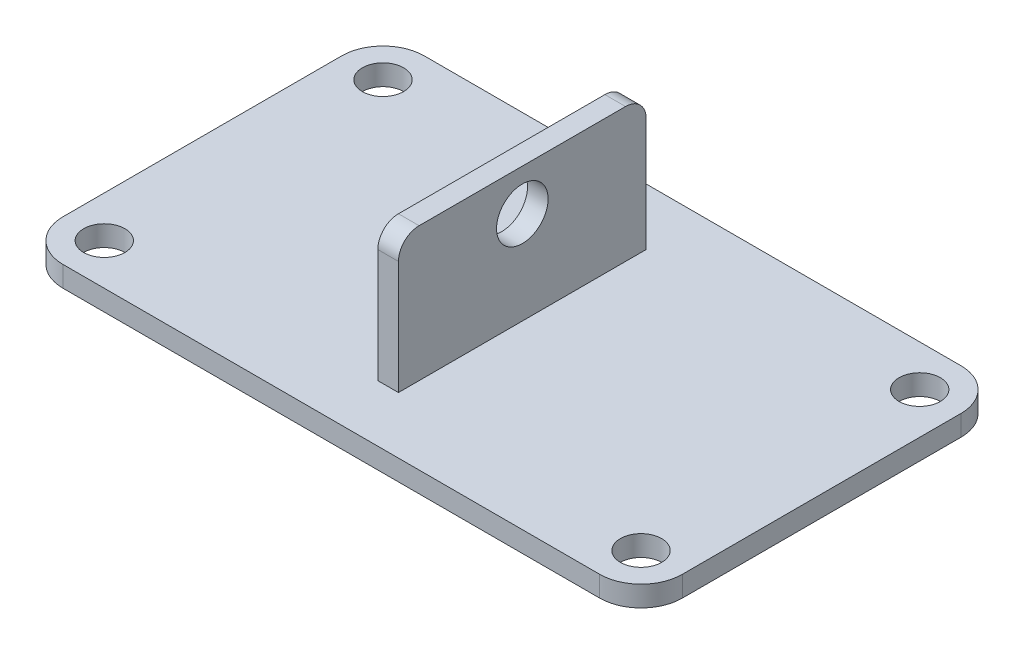
ISO-10303-21;
HEADER;
FILE_DESCRIPTION(('STEP AP214'),'2;1');
FILE_NAME('part.step','',(''),(''),'','','');
FILE_SCHEMA(('AUTOMOTIVE_DESIGN { 1 0 10303 214 1 1 1 1 }'));
ENDSEC;
DATA;
#1=APPLICATION_CONTEXT('core data for automotive mechanical design processes');
#2=APPLICATION_PROTOCOL_DEFINITION('international standard','automotive_design',2000,#1);
#3=PRODUCT_CONTEXT('',#1,'mechanical');
#4=PRODUCT('Part','Part','',(#3));
#5=PRODUCT_RELATED_PRODUCT_CATEGORY('part','',(#4));
#6=PRODUCT_DEFINITION_FORMATION('','',#4);
#7=PRODUCT_DEFINITION_CONTEXT('part definition',#1,'design');
#8=PRODUCT_DEFINITION('design','',#6,#7);
#9=PRODUCT_DEFINITION_SHAPE('','',#8);
#10=(LENGTH_UNIT() NAMED_UNIT(*) SI_UNIT(.MILLI.,.METRE.));
#11=(NAMED_UNIT(*) PLANE_ANGLE_UNIT() SI_UNIT($,.RADIAN.));
#12=(NAMED_UNIT(*) SI_UNIT($,.STERADIAN.) SOLID_ANGLE_UNIT());
#13=UNCERTAINTY_MEASURE_WITH_UNIT(LENGTH_MEASURE(1.E-05),#10,'distance_accuracy_value','');
#14=(GEOMETRIC_REPRESENTATION_CONTEXT(3) GLOBAL_UNCERTAINTY_ASSIGNED_CONTEXT((#13)) GLOBAL_UNIT_ASSIGNED_CONTEXT((#10,
#11,#12)) REPRESENTATION_CONTEXT('',''));
#15=CARTESIAN_POINT('',(0.,0.,0.));
#16=DIRECTION('',(0.,0.,1.));
#17=DIRECTION('',(1.,0.,0.));
#18=AXIS2_PLACEMENT_3D('',#15,#16,#17);
#19=CARTESIAN_POINT('',(0.,10.,0.));
#20=DIRECTION('',(0.,1.,0.));
#21=DIRECTION('',(0.,0.,1.));
#22=AXIS2_PLACEMENT_3D('',#19,#20,#21);
#23=PLANE('',#22);
#24=CARTESIAN_POINT('',(130.,10.,67.5));
#25=DIRECTION('',(0.,1.,0.));
#26=DIRECTION('',(0.,0.,1.));
#27=AXIS2_PLACEMENT_3D('',#24,#25,#26);
#28=CIRCLE('',#27,10.);
#29=CARTESIAN_POINT('',(130.,10.,77.5));
#30=VERTEX_POINT('',#29);
#31=EDGE_CURVE('E483',#30,#30,#28,.T.);
#32=ORIENTED_EDGE('',*,*,#31,.F.);
#33=EDGE_LOOP('',(#32));
#34=FACE_BOUND('',#33,.T.);
#35=CARTESIAN_POINT('',(130.,10.,-67.5));
#36=DIRECTION('',(0.,1.,0.));
#37=DIRECTION('',(0.,0.,1.));
#38=AXIS2_PLACEMENT_3D('',#35,#36,#37);
#39=CIRCLE('',#38,10.);
#40=CARTESIAN_POINT('',(130.,10.,-57.5));
#41=VERTEX_POINT('',#40);
#42=EDGE_CURVE('E490',#41,#41,#39,.T.);
#43=ORIENTED_EDGE('',*,*,#42,.F.);
#44=EDGE_LOOP('',(#43));
#45=FACE_BOUND('',#44,.T.);
#46=CARTESIAN_POINT('',(-130.,10.,67.5));
#47=DIRECTION('',(0.,1.,0.));
#48=DIRECTION('',(0.,0.,1.));
#49=AXIS2_PLACEMENT_3D('',#46,#47,#48);
#50=CIRCLE('',#49,10.);
#51=CARTESIAN_POINT('',(-130.,10.,77.5));
#52=VERTEX_POINT('',#51);
#53=EDGE_CURVE('E500',#52,#52,#50,.T.);
#54=ORIENTED_EDGE('',*,*,#53,.F.);
#55=EDGE_LOOP('',(#54));
#56=FACE_BOUND('',#55,.T.);
#57=CARTESIAN_POINT('',(-130.,10.,-67.5));
#58=DIRECTION('',(0.,1.,0.));
#59=DIRECTION('',(0.,0.,1.));
#60=AXIS2_PLACEMENT_3D('',#57,#58,#59);
#61=CIRCLE('',#60,10.);
#62=CARTESIAN_POINT('',(-130.,10.,-57.5));
#63=VERTEX_POINT('',#62);
#64=EDGE_CURVE('E501',#63,#63,#61,.T.);
#65=ORIENTED_EDGE('',*,*,#64,.F.);
#66=EDGE_LOOP('',(#65));
#67=FACE_BOUND('',#66,.T.);
#68=DIRECTION('',(0.,0.,-1.));
#69=VECTOR('',#68,1.);
#70=CARTESIAN_POINT('',(150.,10.,87.5));
#71=LINE('',#70,#69);
#72=CARTESIAN_POINT('',(150.,10.,67.4999999999999));
#73=VERTEX_POINT('',#72);
#74=CARTESIAN_POINT('',(150.,10.,-67.5));
#75=VERTEX_POINT('',#74);
#76=EDGE_CURVE('E204',#73,#75,#71,.T.);
#77=ORIENTED_EDGE('',*,*,#76,.T.);
#78=CARTESIAN_POINT('',(130.,10.,-67.5));
#79=DIRECTION('',(0.,1.,0.));
#80=DIRECTION('',(0.,0.,1.));
#81=AXIS2_PLACEMENT_3D('',#78,#79,#80);
#82=CIRCLE('',#81,20.);
#83=CARTESIAN_POINT('',(130.,10.,-87.5));
#84=VERTEX_POINT('',#83);
#85=EDGE_CURVE('E261',#75,#84,#82,.T.);
#86=ORIENTED_EDGE('',*,*,#85,.T.);
#87=DIRECTION('',(-1.,0.,0.));
#88=VECTOR('',#87,1.);
#89=CARTESIAN_POINT('',(150.,10.,-87.5));
#90=LINE('',#89,#88);
#91=CARTESIAN_POINT('',(-130.,10.,-87.5));
#92=VERTEX_POINT('',#91);
#93=EDGE_CURVE('E208',#84,#92,#90,.T.);
#94=ORIENTED_EDGE('',*,*,#93,.T.);
#95=CARTESIAN_POINT('',(-130.,10.,-67.5));
#96=DIRECTION('',(0.,1.,0.));
#97=DIRECTION('',(0.,0.,1.));
#98=AXIS2_PLACEMENT_3D('',#95,#96,#97);
#99=CIRCLE('',#98,20.);
#100=CARTESIAN_POINT('',(-150.,10.,-67.5));
#101=VERTEX_POINT('',#100);
#102=EDGE_CURVE('E254',#92,#101,#99,.T.);
#103=ORIENTED_EDGE('',*,*,#102,.T.);
#104=DIRECTION('',(0.,0.,1.));
#105=VECTOR('',#104,1.);
#106=CARTESIAN_POINT('',(-150.,10.,87.5));
#107=LINE('',#106,#105);
#108=CARTESIAN_POINT('',(-150.,10.,67.5));
#109=VERTEX_POINT('',#108);
#110=EDGE_CURVE('E193',#101,#109,#107,.T.);
#111=ORIENTED_EDGE('',*,*,#110,.T.);
#112=CARTESIAN_POINT('',(-130.,10.,67.5));
#113=DIRECTION('',(0.,1.,0.));
#114=DIRECTION('',(0.,0.,1.));
#115=AXIS2_PLACEMENT_3D('',#112,#113,#114);
#116=CIRCLE('',#115,20.);
#117=CARTESIAN_POINT('',(-130.,10.,87.5));
#118=VERTEX_POINT('',#117);
#119=EDGE_CURVE('E252',#109,#118,#116,.T.);
#120=ORIENTED_EDGE('',*,*,#119,.T.);
#121=DIRECTION('',(1.,0.,0.));
#122=VECTOR('',#121,1.);
#123=CARTESIAN_POINT('',(150.,10.,87.5));
#124=LINE('',#123,#122);
#125=CARTESIAN_POINT('',(130.,10.,87.5));
#126=VERTEX_POINT('',#125);
#127=EDGE_CURVE('E200',#118,#126,#124,.T.);
#128=ORIENTED_EDGE('',*,*,#127,.T.);
#129=CARTESIAN_POINT('',(130.,10.,67.4999999999999));
#130=DIRECTION('',(0.,1.,0.));
#131=DIRECTION('',(0.,0.,1.));
#132=AXIS2_PLACEMENT_3D('',#129,#130,#131);
#133=CIRCLE('',#132,20.);
#134=EDGE_CURVE('E256',#126,#73,#133,.T.);
#135=ORIENTED_EDGE('',*,*,#134,.T.);
#136=EDGE_LOOP('',(#77,#86,#94,#103,#111,#120,#128,#135));
#137=FACE_BOUND('',#136,.T.);
#138=DIRECTION('',(-1.,0.,0.));
#139=VECTOR('',#138,1.);
#140=CARTESIAN_POINT('',(5.,10.,60.));
#141=LINE('',#140,#139);
#142=CARTESIAN_POINT('',(5.,10.,60.));
#143=VERTEX_POINT('',#142);
#144=CARTESIAN_POINT('',(-5.,10.,60.));
#145=VERTEX_POINT('',#144);
#146=EDGE_CURVE('E157',#143,#145,#141,.T.);
#147=ORIENTED_EDGE('',*,*,#146,.T.);
#148=DIRECTION('',(0.,0.,-1.));
#149=VECTOR('',#148,1.);
#150=CARTESIAN_POINT('',(-5.,10.,60.));
#151=LINE('',#150,#149);
#152=CARTESIAN_POINT('',(-5.,10.,-60.));
#153=VERTEX_POINT('',#152);
#154=EDGE_CURVE('E181',#145,#153,#151,.T.);
#155=ORIENTED_EDGE('',*,*,#154,.T.);
#156=DIRECTION('',(-1.,0.,0.));
#157=VECTOR('',#156,1.);
#158=CARTESIAN_POINT('',(5.,10.,-60.));
#159=LINE('',#158,#157);
#160=CARTESIAN_POINT('',(5.,10.,-60.));
#161=VERTEX_POINT('',#160);
#162=EDGE_CURVE('E169',#161,#153,#159,.T.);
#163=ORIENTED_EDGE('',*,*,#162,.F.);
#164=DIRECTION('',(0.,0.,-1.));
#165=VECTOR('',#164,1.);
#166=CARTESIAN_POINT('',(5.,10.,60.));
#167=LINE('',#166,#165);
#168=EDGE_CURVE('E155',#143,#161,#167,.T.);
#169=ORIENTED_EDGE('',*,*,#168,.F.);
#170=EDGE_LOOP('',(#147,#155,#163,#169));
#171=FACE_BOUND('',#170,.T.);
#172=ADVANCED_FACE('F44',(#34,#45,#56,#67,#137,#171),#23,.T.);
#173=CARTESIAN_POINT('',(-150.,10.,87.5));
#174=DIRECTION('',(1.,0.,0.));
#175=DIRECTION('',(0.,0.,-1.));
#176=AXIS2_PLACEMENT_3D('',#173,#174,#175);
#177=PLANE('',#176);
#178=ORIENTED_EDGE('',*,*,#110,.F.);
#179=DIRECTION('',(0.,-1.,0.));
#180=VECTOR('',#179,1.);
#181=CARTESIAN_POINT('',(-150.,10.,-67.5));
#182=LINE('',#181,#180);
#183=CARTESIAN_POINT('',(-150.,0.,-67.5));
#184=VERTEX_POINT('',#183);
#185=EDGE_CURVE('E273',#101,#184,#182,.T.);
#186=ORIENTED_EDGE('',*,*,#185,.T.);
#187=DIRECTION('',(0.,0.,1.));
#188=VECTOR('',#187,1.);
#189=CARTESIAN_POINT('',(-150.,0.,87.5));
#190=LINE('',#189,#188);
#191=CARTESIAN_POINT('',(-150.,0.,67.5));
#192=VERTEX_POINT('',#191);
#193=EDGE_CURVE('E170',#184,#192,#190,.T.);
#194=ORIENTED_EDGE('',*,*,#193,.T.);
#195=DIRECTION('',(0.,-1.,0.));
#196=VECTOR('',#195,1.);
#197=CARTESIAN_POINT('',(-150.,10.,67.5));
#198=LINE('',#197,#196);
#199=EDGE_CURVE('E271',#192,#109,#198,.F.);
#200=ORIENTED_EDGE('',*,*,#199,.T.);
#201=EDGE_LOOP('',(#178,#186,#194,#200));
#202=FACE_BOUND('',#201,.T.);
#203=ADVANCED_FACE('F317',(#202),#177,.F.);
#204=CARTESIAN_POINT('',(150.,10.,87.5));
#205=DIRECTION('',(0.,0.,-1.));
#206=DIRECTION('',(-1.,0.,0.));
#207=AXIS2_PLACEMENT_3D('',#204,#205,#206);
#208=PLANE('',#207);
#209=DIRECTION('',(1.,0.,0.));
#210=VECTOR('',#209,1.);
#211=CARTESIAN_POINT('',(150.,0.,87.5));
#212=LINE('',#211,#210);
#213=CARTESIAN_POINT('',(-130.,0.,87.5));
#214=VERTEX_POINT('',#213);
#215=CARTESIAN_POINT('',(130.,0.,87.5));
#216=VERTEX_POINT('',#215);
#217=EDGE_CURVE('E216',#214,#216,#212,.T.);
#218=ORIENTED_EDGE('',*,*,#217,.T.);
#219=DIRECTION('',(0.,-1.,0.));
#220=VECTOR('',#219,1.);
#221=CARTESIAN_POINT('',(130.,10.,87.5));
#222=LINE('',#221,#220);
#223=EDGE_CURVE('E268',#216,#126,#222,.F.);
#224=ORIENTED_EDGE('',*,*,#223,.T.);
#225=ORIENTED_EDGE('',*,*,#127,.F.);
#226=DIRECTION('',(0.,-1.,0.));
#227=VECTOR('',#226,1.);
#228=CARTESIAN_POINT('',(-130.,10.,87.5));
#229=LINE('',#228,#227);
#230=EDGE_CURVE('E262',#118,#214,#229,.T.);
#231=ORIENTED_EDGE('',*,*,#230,.T.);
#232=EDGE_LOOP('',(#218,#224,#225,#231));
#233=FACE_BOUND('',#232,.T.);
#234=ADVANCED_FACE('F330',(#233),#208,.F.);
#235=CARTESIAN_POINT('',(150.,10.,87.5));
#236=DIRECTION('',(-1.,0.,0.));
#237=DIRECTION('',(0.,0.,1.));
#238=AXIS2_PLACEMENT_3D('',#235,#236,#237);
#239=PLANE('',#238);
#240=DIRECTION('',(0.,0.,-1.));
#241=VECTOR('',#240,1.);
#242=CARTESIAN_POINT('',(150.,0.,87.5));
#243=LINE('',#242,#241);
#244=CARTESIAN_POINT('',(150.,0.,67.4999999999999));
#245=VERTEX_POINT('',#244);
#246=CARTESIAN_POINT('',(150.,0.,-67.5));
#247=VERTEX_POINT('',#246);
#248=EDGE_CURVE('E219',#245,#247,#243,.T.);
#249=ORIENTED_EDGE('',*,*,#248,.T.);
#250=DIRECTION('',(0.,-1.,0.));
#251=VECTOR('',#250,1.);
#252=CARTESIAN_POINT('',(150.,10.,-67.5));
#253=LINE('',#252,#251);
#254=EDGE_CURVE('E246',#247,#75,#253,.F.);
#255=ORIENTED_EDGE('',*,*,#254,.T.);
#256=ORIENTED_EDGE('',*,*,#76,.F.);
#257=DIRECTION('',(0.,-1.,0.));
#258=VECTOR('',#257,1.);
#259=CARTESIAN_POINT('',(150.,10.,67.4999999999999));
#260=LINE('',#259,#258);
#261=EDGE_CURVE('E241',#73,#245,#260,.T.);
#262=ORIENTED_EDGE('',*,*,#261,.T.);
#263=EDGE_LOOP('',(#249,#255,#256,#262));
#264=FACE_BOUND('',#263,.T.);
#265=ADVANCED_FACE('F340',(#264),#239,.F.);
#266=CARTESIAN_POINT('',(150.,10.,-87.5));
#267=DIRECTION('',(0.,0.,1.));
#268=DIRECTION('',(1.,0.,0.));
#269=AXIS2_PLACEMENT_3D('',#266,#267,#268);
#270=PLANE('',#269);
#271=ORIENTED_EDGE('',*,*,#93,.F.);
#272=DIRECTION('',(0.,-1.,0.));
#273=VECTOR('',#272,1.);
#274=CARTESIAN_POINT('',(130.,10.,-87.5));
#275=LINE('',#274,#273);
#276=CARTESIAN_POINT('',(130.,0.,-87.5));
#277=VERTEX_POINT('',#276);
#278=EDGE_CURVE('E230',#84,#277,#275,.T.);
#279=ORIENTED_EDGE('',*,*,#278,.T.);
#280=DIRECTION('',(-1.,0.,0.));
#281=VECTOR('',#280,1.);
#282=CARTESIAN_POINT('',(150.,0.,-87.5));
#283=LINE('',#282,#281);
#284=CARTESIAN_POINT('',(-130.,0.,-87.5));
#285=VERTEX_POINT('',#284);
#286=EDGE_CURVE('E199',#277,#285,#283,.T.);
#287=ORIENTED_EDGE('',*,*,#286,.T.);
#288=DIRECTION('',(0.,-1.,0.));
#289=VECTOR('',#288,1.);
#290=CARTESIAN_POINT('',(-130.,10.,-87.5));
#291=LINE('',#290,#289);
#292=EDGE_CURVE('E215',#285,#92,#291,.F.);
#293=ORIENTED_EDGE('',*,*,#292,.T.);
#294=EDGE_LOOP('',(#271,#279,#287,#293));
#295=FACE_BOUND('',#294,.T.);
#296=ADVANCED_FACE('F333',(#295),#270,.F.);
#297=CARTESIAN_POINT('',(0.,0.,0.));
#298=DIRECTION('',(0.,1.,0.));
#299=DIRECTION('',(0.,0.,1.));
#300=AXIS2_PLACEMENT_3D('',#297,#298,#299);
#301=PLANE('',#300);
#302=CARTESIAN_POINT('',(130.,0.,67.5));
#303=DIRECTION('',(0.,1.,0.));
#304=DIRECTION('',(0.,0.,1.));
#305=AXIS2_PLACEMENT_3D('',#302,#303,#304);
#306=CIRCLE('',#305,10.);
#307=CARTESIAN_POINT('',(130.,0.,77.5));
#308=VERTEX_POINT('',#307);
#309=EDGE_CURVE('E481',#308,#308,#306,.T.);
#310=ORIENTED_EDGE('',*,*,#309,.T.);
#311=EDGE_LOOP('',(#310));
#312=FACE_BOUND('',#311,.T.);
#313=CARTESIAN_POINT('',(130.,0.,-67.5));
#314=DIRECTION('',(0.,1.,0.));
#315=DIRECTION('',(0.,0.,1.));
#316=AXIS2_PLACEMENT_3D('',#313,#314,#315);
#317=CIRCLE('',#316,10.);
#318=CARTESIAN_POINT('',(130.,0.,-57.5));
#319=VERTEX_POINT('',#318);
#320=EDGE_CURVE('E492',#319,#319,#317,.T.);
#321=ORIENTED_EDGE('',*,*,#320,.T.);
#322=EDGE_LOOP('',(#321));
#323=FACE_BOUND('',#322,.T.);
#324=CARTESIAN_POINT('',(-130.,0.,67.5));
#325=DIRECTION('',(0.,1.,0.));
#326=DIRECTION('',(0.,0.,1.));
#327=AXIS2_PLACEMENT_3D('',#324,#325,#326);
#328=CIRCLE('',#327,10.);
#329=CARTESIAN_POINT('',(-130.,0.,77.5));
#330=VERTEX_POINT('',#329);
#331=EDGE_CURVE('E503',#330,#330,#328,.T.);
#332=ORIENTED_EDGE('',*,*,#331,.T.);
#333=EDGE_LOOP('',(#332));
#334=FACE_BOUND('',#333,.T.);
#335=CARTESIAN_POINT('',(-130.,0.,-67.5));
#336=DIRECTION('',(0.,1.,0.));
#337=DIRECTION('',(0.,0.,1.));
#338=AXIS2_PLACEMENT_3D('',#335,#336,#337);
#339=CIRCLE('',#338,10.);
#340=CARTESIAN_POINT('',(-130.,0.,-57.5));
#341=VERTEX_POINT('',#340);
#342=EDGE_CURVE('E506',#341,#341,#339,.T.);
#343=ORIENTED_EDGE('',*,*,#342,.T.);
#344=EDGE_LOOP('',(#343));
#345=FACE_BOUND('',#344,.T.);
#346=ORIENTED_EDGE('',*,*,#286,.F.);
#347=CARTESIAN_POINT('',(130.,0.,-67.5));
#348=DIRECTION('',(0.,1.,0.));
#349=DIRECTION('',(0.,0.,1.));
#350=AXIS2_PLACEMENT_3D('',#347,#348,#349);
#351=CIRCLE('',#350,20.);
#352=EDGE_CURVE('E244',#277,#247,#351,.F.);
#353=ORIENTED_EDGE('',*,*,#352,.T.);
#354=ORIENTED_EDGE('',*,*,#248,.F.);
#355=CARTESIAN_POINT('',(130.,0.,67.4999999999999));
#356=DIRECTION('',(0.,1.,0.));
#357=DIRECTION('',(0.,0.,1.));
#358=AXIS2_PLACEMENT_3D('',#355,#356,#357);
#359=CIRCLE('',#358,20.);
#360=EDGE_CURVE('E239',#245,#216,#359,.F.);
#361=ORIENTED_EDGE('',*,*,#360,.T.);
#362=ORIENTED_EDGE('',*,*,#217,.F.);
#363=CARTESIAN_POINT('',(-130.,0.,67.5));
#364=DIRECTION('',(0.,1.,0.));
#365=DIRECTION('',(0.,0.,1.));
#366=AXIS2_PLACEMENT_3D('',#363,#364,#365);
#367=CIRCLE('',#366,20.);
#368=EDGE_CURVE('E234',#214,#192,#367,.F.);
#369=ORIENTED_EDGE('',*,*,#368,.T.);
#370=ORIENTED_EDGE('',*,*,#193,.F.);
#371=CARTESIAN_POINT('',(-130.,0.,-67.5));
#372=DIRECTION('',(0.,1.,0.));
#373=DIRECTION('',(0.,0.,1.));
#374=AXIS2_PLACEMENT_3D('',#371,#372,#373);
#375=CIRCLE('',#374,20.);
#376=EDGE_CURVE('E237',#184,#285,#375,.F.);
#377=ORIENTED_EDGE('',*,*,#376,.T.);
#378=EDGE_LOOP('',(#346,#353,#354,#361,#362,#369,#370,#377));
#379=FACE_BOUND('',#378,.T.);
#380=ADVANCED_FACE('F334',(#312,#323,#334,#345,#379),#301,.F.);
#381=CARTESIAN_POINT('',(5.,0.,0.));
#382=DIRECTION('',(-1.,0.,0.));
#383=DIRECTION('',(0.,0.,1.));
#384=AXIS2_PLACEMENT_3D('',#381,#382,#383);
#385=PLANE('',#384);
#386=DIRECTION('',(0.,1.,0.));
#387=VECTOR('',#386,1.);
#388=CARTESIAN_POINT('',(5.,10.,-60.));
#389=LINE('',#388,#387);
#390=CARTESIAN_POINT('',(5.,65.,-60.));
#391=VERTEX_POINT('',#390);
#392=EDGE_CURVE('E174',#161,#391,#389,.T.);
#393=ORIENTED_EDGE('',*,*,#392,.T.);
#394=CARTESIAN_POINT('',(5.,65.,-50.));
#395=DIRECTION('',(-1.,0.,0.));
#396=DIRECTION('',(0.,0.,1.));
#397=AXIS2_PLACEMENT_3D('',#394,#395,#396);
#398=CIRCLE('',#397,10.);
#399=CARTESIAN_POINT('',(5.,75.,-50.));
#400=VERTEX_POINT('',#399);
#401=EDGE_CURVE('E53',#391,#400,#398,.F.);
#402=ORIENTED_EDGE('',*,*,#401,.T.);
#403=DIRECTION('',(0.,0.,1.));
#404=VECTOR('',#403,1.);
#405=CARTESIAN_POINT('',(5.,75.,60.));
#406=LINE('',#405,#404);
#407=CARTESIAN_POINT('',(5.,75.,50.));
#408=VERTEX_POINT('',#407);
#409=EDGE_CURVE('E171',#400,#408,#406,.T.);
#410=ORIENTED_EDGE('',*,*,#409,.T.);
#411=CARTESIAN_POINT('',(5.,65.,50.));
#412=DIRECTION('',(-1.,0.,0.));
#413=DIRECTION('',(0.,0.,1.));
#414=AXIS2_PLACEMENT_3D('',#411,#412,#413);
#415=CIRCLE('',#414,10.);
#416=CARTESIAN_POINT('',(5.,65.,60.));
#417=VERTEX_POINT('',#416);
#418=EDGE_CURVE('E63',#408,#417,#415,.F.);
#419=ORIENTED_EDGE('',*,*,#418,.T.);
#420=DIRECTION('',(0.,-1.,0.));
#421=VECTOR('',#420,1.);
#422=CARTESIAN_POINT('',(5.,10.,60.));
#423=LINE('',#422,#421);
#424=EDGE_CURVE('E150',#417,#143,#423,.T.);
#425=ORIENTED_EDGE('',*,*,#424,.T.);
#426=ORIENTED_EDGE('',*,*,#168,.T.);
#427=EDGE_LOOP('',(#393,#402,#410,#419,#425,#426));
#428=FACE_BOUND('',#427,.T.);
#429=CARTESIAN_POINT('',(5.,55.,0.));
#430=DIRECTION('',(1.,0.,0.));
#431=DIRECTION('',(0.,0.,-1.));
#432=AXIS2_PLACEMENT_3D('',#429,#430,#431);
#433=CIRCLE('',#432,12.5);
#434=CARTESIAN_POINT('',(5.,55.,-12.5));
#435=VERTEX_POINT('',#434);
#436=EDGE_CURVE('E184',#435,#435,#433,.T.);
#437=ORIENTED_EDGE('',*,*,#436,.F.);
#438=EDGE_LOOP('',(#437));
#439=FACE_BOUND('',#438,.T.);
#440=ADVANCED_FACE('F149',(#428,#439),#385,.F.);
#441=CARTESIAN_POINT('',(-5.,0.,0.));
#442=DIRECTION('',(-1.,0.,0.));
#443=DIRECTION('',(0.,0.,1.));
#444=AXIS2_PLACEMENT_3D('',#441,#442,#443);
#445=PLANE('',#444);
#446=DIRECTION('',(0.,0.,1.));
#447=VECTOR('',#446,1.);
#448=CARTESIAN_POINT('',(-5.,75.,60.));
#449=LINE('',#448,#447);
#450=CARTESIAN_POINT('',(-5.,75.,-50.));
#451=VERTEX_POINT('',#450);
#452=CARTESIAN_POINT('',(-5.,75.,50.));
#453=VERTEX_POINT('',#452);
#454=EDGE_CURVE('E156',#451,#453,#449,.T.);
#455=ORIENTED_EDGE('',*,*,#454,.F.);
#456=CARTESIAN_POINT('',(-5.,65.,-50.));
#457=DIRECTION('',(-1.,0.,0.));
#458=DIRECTION('',(0.,0.,1.));
#459=AXIS2_PLACEMENT_3D('',#456,#457,#458);
#460=CIRCLE('',#459,10.);
#461=CARTESIAN_POINT('',(-5.,65.,-60.));
#462=VERTEX_POINT('',#461);
#463=EDGE_CURVE('E289',#451,#462,#460,.T.);
#464=ORIENTED_EDGE('',*,*,#463,.T.);
#465=DIRECTION('',(0.,1.,0.));
#466=VECTOR('',#465,1.);
#467=CARTESIAN_POINT('',(-5.,10.,-60.));
#468=LINE('',#467,#466);
#469=EDGE_CURVE('E189',#153,#462,#468,.T.);
#470=ORIENTED_EDGE('',*,*,#469,.F.);
#471=ORIENTED_EDGE('',*,*,#154,.F.);
#472=DIRECTION('',(0.,-1.,0.));
#473=VECTOR('',#472,1.);
#474=CARTESIAN_POINT('',(-5.,10.,60.));
#475=LINE('',#474,#473);
#476=CARTESIAN_POINT('',(-5.,65.,60.));
#477=VERTEX_POINT('',#476);
#478=EDGE_CURVE('E165',#477,#145,#475,.T.);
#479=ORIENTED_EDGE('',*,*,#478,.F.);
#480=CARTESIAN_POINT('',(-5.,65.,50.));
#481=DIRECTION('',(-1.,0.,0.));
#482=DIRECTION('',(0.,0.,1.));
#483=AXIS2_PLACEMENT_3D('',#480,#481,#482);
#484=CIRCLE('',#483,10.);
#485=EDGE_CURVE('E281',#477,#453,#484,.T.);
#486=ORIENTED_EDGE('',*,*,#485,.T.);
#487=EDGE_LOOP('',(#455,#464,#470,#471,#479,#486));
#488=FACE_BOUND('',#487,.T.);
#489=CARTESIAN_POINT('',(-5.,55.,0.));
#490=DIRECTION('',(1.,0.,0.));
#491=DIRECTION('',(0.,0.,-1.));
#492=AXIS2_PLACEMENT_3D('',#489,#490,#491);
#493=CIRCLE('',#492,12.5);
#494=CARTESIAN_POINT('',(-5.,55.,-12.5));
#495=VERTEX_POINT('',#494);
#496=EDGE_CURVE('E511',#495,#495,#493,.T.);
#497=ORIENTED_EDGE('',*,*,#496,.T.);
#498=EDGE_LOOP('',(#497));
#499=FACE_BOUND('',#498,.T.);
#500=ADVANCED_FACE('F308',(#488,#499),#445,.T.);
#501=CARTESIAN_POINT('',(5.,10.,60.));
#502=DIRECTION('',(0.,0.,-1.));
#503=DIRECTION('',(-1.,0.,0.));
#504=AXIS2_PLACEMENT_3D('',#501,#502,#503);
#505=PLANE('',#504);
#506=ORIENTED_EDGE('',*,*,#424,.F.);
#507=DIRECTION('',(-1.,0.,0.));
#508=VECTOR('',#507,1.);
#509=CARTESIAN_POINT('',(5.,65.,60.));
#510=LINE('',#509,#508);
#511=EDGE_CURVE('E11',#417,#477,#510,.T.);
#512=ORIENTED_EDGE('',*,*,#511,.T.);
#513=ORIENTED_EDGE('',*,*,#478,.T.);
#514=ORIENTED_EDGE('',*,*,#146,.F.);
#515=EDGE_LOOP('',(#506,#512,#513,#514));
#516=FACE_BOUND('',#515,.T.);
#517=ADVANCED_FACE('F159',(#516),#505,.F.);
#518=CARTESIAN_POINT('',(5.,10.,-60.));
#519=DIRECTION('',(0.,0.,1.));
#520=DIRECTION('',(1.,0.,0.));
#521=AXIS2_PLACEMENT_3D('',#518,#519,#520);
#522=PLANE('',#521);
#523=ORIENTED_EDGE('',*,*,#469,.T.);
#524=DIRECTION('',(-1.,0.,0.));
#525=VECTOR('',#524,1.);
#526=CARTESIAN_POINT('',(5.,65.,-60.));
#527=LINE('',#526,#525);
#528=EDGE_CURVE('E66',#462,#391,#527,.F.);
#529=ORIENTED_EDGE('',*,*,#528,.T.);
#530=ORIENTED_EDGE('',*,*,#392,.F.);
#531=ORIENTED_EDGE('',*,*,#162,.T.);
#532=EDGE_LOOP('',(#523,#529,#530,#531));
#533=FACE_BOUND('',#532,.T.);
#534=ADVANCED_FACE('F306',(#533),#522,.F.);
#535=CARTESIAN_POINT('',(5.,75.,60.));
#536=DIRECTION('',(0.,-1.,0.));
#537=DIRECTION('',(0.,0.,-1.));
#538=AXIS2_PLACEMENT_3D('',#535,#536,#537);
#539=PLANE('',#538);
#540=ORIENTED_EDGE('',*,*,#409,.F.);
#541=DIRECTION('',(-1.,0.,0.));
#542=VECTOR('',#541,1.);
#543=CARTESIAN_POINT('',(5.,75.,-50.));
#544=LINE('',#543,#542);
#545=EDGE_CURVE('E283',#400,#451,#544,.T.);
#546=ORIENTED_EDGE('',*,*,#545,.T.);
#547=ORIENTED_EDGE('',*,*,#454,.T.);
#548=DIRECTION('',(-1.,0.,0.));
#549=VECTOR('',#548,1.);
#550=CARTESIAN_POINT('',(5.,75.,50.));
#551=LINE('',#550,#549);
#552=EDGE_CURVE('E279',#453,#408,#551,.F.);
#553=ORIENTED_EDGE('',*,*,#552,.T.);
#554=EDGE_LOOP('',(#540,#546,#547,#553));
#555=FACE_BOUND('',#554,.T.);
#556=ADVANCED_FACE('F296',(#555),#539,.F.);
#557=CARTESIAN_POINT('',(5.,55.,0.));
#558=DIRECTION('',(-1.,0.,0.));
#559=DIRECTION('',(0.,0.,1.));
#560=AXIS2_PLACEMENT_3D('',#557,#558,#559);
#561=CYLINDRICAL_SURFACE('',#560,12.5);
#562=ORIENTED_EDGE('',*,*,#436,.T.);
#563=EDGE_LOOP('',(#562));
#564=FACE_BOUND('',#563,.T.);
#565=ORIENTED_EDGE('',*,*,#496,.F.);
#566=EDGE_LOOP('',(#565));
#567=FACE_BOUND('',#566,.T.);
#568=ADVANCED_FACE('F312',(#564,#567),#561,.F.);
#569=CARTESIAN_POINT('',(130.,10.,-67.5));
#570=DIRECTION('',(0.,-1.,0.));
#571=DIRECTION('',(0.,0.,-1.));
#572=AXIS2_PLACEMENT_3D('',#569,#570,#571);
#573=CYLINDRICAL_SURFACE('',#572,20.);
#574=ORIENTED_EDGE('',*,*,#85,.F.);
#575=ORIENTED_EDGE('',*,*,#254,.F.);
#576=ORIENTED_EDGE('',*,*,#352,.F.);
#577=ORIENTED_EDGE('',*,*,#278,.F.);
#578=EDGE_LOOP('',(#574,#575,#576,#577));
#579=FACE_BOUND('',#578,.T.);
#580=ADVANCED_FACE('F350',(#579),#573,.T.);
#581=CARTESIAN_POINT('',(130.,10.,67.4999999999999));
#582=DIRECTION('',(0.,-1.,0.));
#583=DIRECTION('',(0.,0.,-1.));
#584=AXIS2_PLACEMENT_3D('',#581,#582,#583);
#585=CYLINDRICAL_SURFACE('',#584,20.);
#586=ORIENTED_EDGE('',*,*,#134,.F.);
#587=ORIENTED_EDGE('',*,*,#223,.F.);
#588=ORIENTED_EDGE('',*,*,#360,.F.);
#589=ORIENTED_EDGE('',*,*,#261,.F.);
#590=EDGE_LOOP('',(#586,#587,#588,#589));
#591=FACE_BOUND('',#590,.T.);
#592=ADVANCED_FACE('F348',(#591),#585,.T.);
#593=CARTESIAN_POINT('',(-130.,10.,-67.5));
#594=DIRECTION('',(0.,-1.,0.));
#595=DIRECTION('',(0.,0.,-1.));
#596=AXIS2_PLACEMENT_3D('',#593,#594,#595);
#597=CYLINDRICAL_SURFACE('',#596,20.);
#598=ORIENTED_EDGE('',*,*,#102,.F.);
#599=ORIENTED_EDGE('',*,*,#292,.F.);
#600=ORIENTED_EDGE('',*,*,#376,.F.);
#601=ORIENTED_EDGE('',*,*,#185,.F.);
#602=EDGE_LOOP('',(#598,#599,#600,#601));
#603=FACE_BOUND('',#602,.T.);
#604=ADVANCED_FACE('F355',(#603),#597,.T.);
#605=CARTESIAN_POINT('',(-130.,10.,67.5));
#606=DIRECTION('',(0.,-1.,0.));
#607=DIRECTION('',(0.,0.,-1.));
#608=AXIS2_PLACEMENT_3D('',#605,#606,#607);
#609=CYLINDRICAL_SURFACE('',#608,20.);
#610=ORIENTED_EDGE('',*,*,#119,.F.);
#611=ORIENTED_EDGE('',*,*,#199,.F.);
#612=ORIENTED_EDGE('',*,*,#368,.F.);
#613=ORIENTED_EDGE('',*,*,#230,.F.);
#614=EDGE_LOOP('',(#610,#611,#612,#613));
#615=FACE_BOUND('',#614,.T.);
#616=ADVANCED_FACE('F359',(#615),#609,.T.);
#617=CARTESIAN_POINT('',(5.,65.,-50.));
#618=DIRECTION('',(-1.,0.,0.));
#619=DIRECTION('',(0.,0.,1.));
#620=AXIS2_PLACEMENT_3D('',#617,#618,#619);
#621=CYLINDRICAL_SURFACE('',#620,10.);
#622=ORIENTED_EDGE('',*,*,#401,.F.);
#623=ORIENTED_EDGE('',*,*,#528,.F.);
#624=ORIENTED_EDGE('',*,*,#463,.F.);
#625=ORIENTED_EDGE('',*,*,#545,.F.);
#626=EDGE_LOOP('',(#622,#623,#624,#625));
#627=FACE_BOUND('',#626,.T.);
#628=ADVANCED_FACE('F304',(#627),#621,.T.);
#629=CARTESIAN_POINT('',(5.,65.,50.));
#630=DIRECTION('',(-1.,0.,0.));
#631=DIRECTION('',(0.,0.,1.));
#632=AXIS2_PLACEMENT_3D('',#629,#630,#631);
#633=CYLINDRICAL_SURFACE('',#632,10.);
#634=ORIENTED_EDGE('',*,*,#418,.F.);
#635=ORIENTED_EDGE('',*,*,#552,.F.);
#636=ORIENTED_EDGE('',*,*,#485,.F.);
#637=ORIENTED_EDGE('',*,*,#511,.F.);
#638=EDGE_LOOP('',(#634,#635,#636,#637));
#639=FACE_BOUND('',#638,.T.);
#640=ADVANCED_FACE('F50',(#639),#633,.T.);
#641=CARTESIAN_POINT('',(-130.,10.,-67.5));
#642=DIRECTION('',(0.,1.,0.));
#643=DIRECTION('',(0.,0.,1.));
#644=AXIS2_PLACEMENT_3D('',#641,#642,#643);
#645=CYLINDRICAL_SURFACE('',#644,10.);
#646=ORIENTED_EDGE('',*,*,#342,.F.);
#647=EDGE_LOOP('',(#646));
#648=FACE_BOUND('',#647,.T.);
#649=ORIENTED_EDGE('',*,*,#64,.T.);
#650=EDGE_LOOP('',(#649));
#651=FACE_BOUND('',#650,.T.);
#652=ADVANCED_FACE('F368',(#648,#651),#645,.F.);
#653=CARTESIAN_POINT('',(-130.,10.,67.5));
#654=DIRECTION('',(0.,1.,0.));
#655=DIRECTION('',(0.,0.,1.));
#656=AXIS2_PLACEMENT_3D('',#653,#654,#655);
#657=CYLINDRICAL_SURFACE('',#656,10.);
#658=ORIENTED_EDGE('',*,*,#331,.F.);
#659=EDGE_LOOP('',(#658));
#660=FACE_BOUND('',#659,.T.);
#661=ORIENTED_EDGE('',*,*,#53,.T.);
#662=EDGE_LOOP('',(#661));
#663=FACE_BOUND('',#662,.T.);
#664=ADVANCED_FACE('F371',(#660,#663),#657,.F.);
#665=CARTESIAN_POINT('',(130.,10.,-67.5));
#666=DIRECTION('',(0.,1.,0.));
#667=DIRECTION('',(0.,0.,1.));
#668=AXIS2_PLACEMENT_3D('',#665,#666,#667);
#669=CYLINDRICAL_SURFACE('',#668,10.);
#670=ORIENTED_EDGE('',*,*,#320,.F.);
#671=EDGE_LOOP('',(#670));
#672=FACE_BOUND('',#671,.T.);
#673=ORIENTED_EDGE('',*,*,#42,.T.);
#674=EDGE_LOOP('',(#673));
#675=FACE_BOUND('',#674,.T.);
#676=ADVANCED_FACE('F376',(#672,#675),#669,.F.);
#677=CARTESIAN_POINT('',(130.,10.,67.5));
#678=DIRECTION('',(0.,1.,0.));
#679=DIRECTION('',(0.,0.,1.));
#680=AXIS2_PLACEMENT_3D('',#677,#678,#679);
#681=CYLINDRICAL_SURFACE('',#680,10.);
#682=ORIENTED_EDGE('',*,*,#309,.F.);
#683=EDGE_LOOP('',(#682));
#684=FACE_BOUND('',#683,.T.);
#685=ORIENTED_EDGE('',*,*,#31,.T.);
#686=EDGE_LOOP('',(#685));
#687=FACE_BOUND('',#686,.T.);
#688=ADVANCED_FACE('F467',(#684,#687),#681,.F.);
#689=CLOSED_SHELL('',(#172,#203,#234,#265,#296,#380,#440,#500,#517,#534,#556,#568,#580,#592,
#604,#616,#628,#640,#652,#664,#676,#688));
#690=MANIFOLD_SOLID_BREP('B2',#689);
#691=ADVANCED_BREP_SHAPE_REPRESENTATION('',(#18,#690),#14);
#692=SHAPE_DEFINITION_REPRESENTATION(#9,#691);
ENDSEC;
END-ISO-10303-21;
